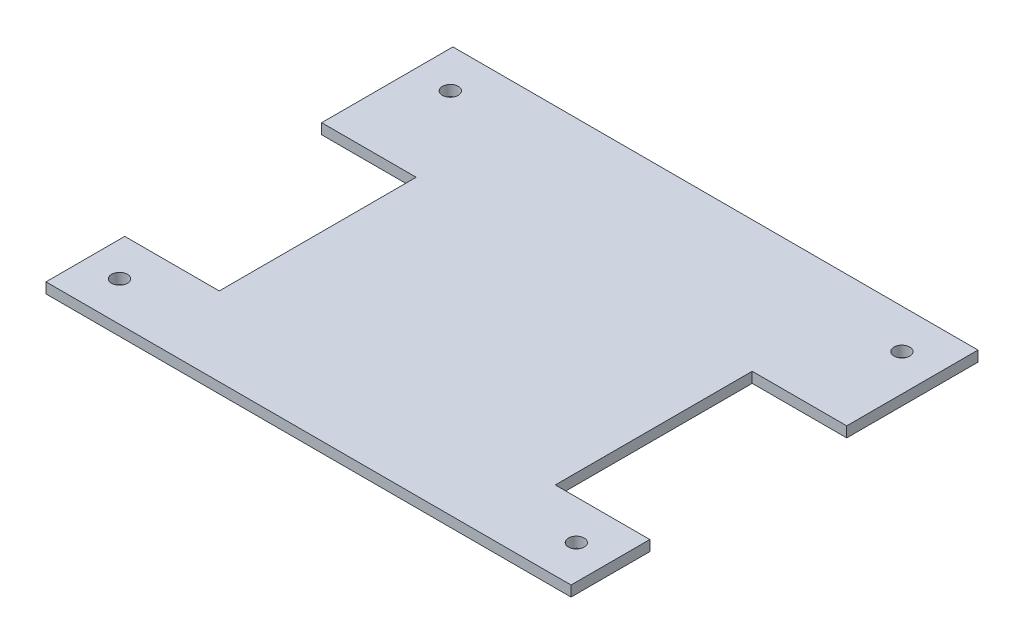
ISO-10303-21;
HEADER;
FILE_DESCRIPTION(('STEP AP214'),'2;1');
FILE_NAME('part.step','',(''),(''),'','','');
FILE_SCHEMA(('AUTOMOTIVE_DESIGN { 1 0 10303 214 1 1 1 1 }'));
ENDSEC;
DATA;
#1=APPLICATION_CONTEXT('core data for automotive mechanical design processes');
#2=APPLICATION_PROTOCOL_DEFINITION('international standard','automotive_design',2000,#1);
#3=PRODUCT_CONTEXT('',#1,'mechanical');
#4=PRODUCT('Part','Part','',(#3));
#5=PRODUCT_RELATED_PRODUCT_CATEGORY('part','',(#4));
#6=PRODUCT_DEFINITION_FORMATION('','',#4);
#7=PRODUCT_DEFINITION_CONTEXT('part definition',#1,'design');
#8=PRODUCT_DEFINITION('design','',#6,#7);
#9=PRODUCT_DEFINITION_SHAPE('','',#8);
#10=(LENGTH_UNIT() NAMED_UNIT(*) SI_UNIT(.MILLI.,.METRE.));
#11=(NAMED_UNIT(*) PLANE_ANGLE_UNIT() SI_UNIT($,.RADIAN.));
#12=(NAMED_UNIT(*) SI_UNIT($,.STERADIAN.) SOLID_ANGLE_UNIT());
#13=UNCERTAINTY_MEASURE_WITH_UNIT(LENGTH_MEASURE(1.E-05),#10,'distance_accuracy_value','');
#14=(GEOMETRIC_REPRESENTATION_CONTEXT(3) GLOBAL_UNCERTAINTY_ASSIGNED_CONTEXT((#13)) GLOBAL_UNIT_ASSIGNED_CONTEXT((#10,
#11,#12)) REPRESENTATION_CONTEXT('',''));
#15=CARTESIAN_POINT('',(0.,0.,0.));
#16=DIRECTION('',(0.,0.,1.));
#17=DIRECTION('',(1.,0.,0.));
#18=AXIS2_PLACEMENT_3D('',#15,#16,#17);
#19=CARTESIAN_POINT('',(0.,4.,0.));
#20=DIRECTION('',(0.,-1.,0.));
#21=DIRECTION('',(0.,0.,-1.));
#22=AXIS2_PLACEMENT_3D('',#19,#20,#21);
#23=PLANE('',#22);
#24=DIRECTION('',(0.,0.,1.));
#25=VECTOR('',#24,1.);
#26=CARTESIAN_POINT('',(-128.417283329708,4.,77.672449199559));
#27=LINE('',#26,#25);
#28=CARTESIAN_POINT('',(-128.417283329708,4.,77.672449199559));
#29=VERTEX_POINT('',#28);
#30=CARTESIAN_POINT('',(-128.417283329708,4.,107.672449199559));
#31=VERTEX_POINT('',#30);
#32=EDGE_CURVE('E204',#29,#31,#27,.T.);
#33=ORIENTED_EDGE('',*,*,#32,.T.);
#34=DIRECTION('',(1.,0.,0.));
#35=VECTOR('',#34,1.);
#36=CARTESIAN_POINT('',(71.5827166702925,4.,107.672449199559));
#37=LINE('',#36,#35);
#38=CARTESIAN_POINT('',(71.5827166702925,4.,107.672449199559));
#39=VERTEX_POINT('',#38);
#40=EDGE_CURVE('E116',#31,#39,#37,.T.);
#41=ORIENTED_EDGE('',*,*,#40,.T.);
#42=DIRECTION('',(0.,0.,-1.));
#43=VECTOR('',#42,1.);
#44=CARTESIAN_POINT('',(71.5827166702924,4.,77.672449199559));
#45=LINE('',#44,#43);
#46=CARTESIAN_POINT('',(71.5827166702924,4.,77.672449199559));
#47=VERTEX_POINT('',#46);
#48=EDGE_CURVE('E241',#39,#47,#45,.T.);
#49=ORIENTED_EDGE('',*,*,#48,.T.);
#50=DIRECTION('',(-1.,0.,0.));
#51=VECTOR('',#50,1.);
#52=CARTESIAN_POINT('',(35.5827166702924,4.,77.672449199559));
#53=LINE('',#52,#51);
#54=CARTESIAN_POINT('',(35.5827166702924,4.,77.672449199559));
#55=VERTEX_POINT('',#54);
#56=EDGE_CURVE('E261',#47,#55,#53,.T.);
#57=ORIENTED_EDGE('',*,*,#56,.T.);
#58=DIRECTION('',(0.,0.,-1.));
#59=VECTOR('',#58,1.);
#60=CARTESIAN_POINT('',(35.5827166702924,4.,2.67244919955896));
#61=LINE('',#60,#59);
#62=CARTESIAN_POINT('',(35.5827166702924,4.,2.67244919955896));
#63=VERTEX_POINT('',#62);
#64=EDGE_CURVE('E257',#55,#63,#61,.T.);
#65=ORIENTED_EDGE('',*,*,#64,.T.);
#66=DIRECTION('',(1.,0.,0.));
#67=VECTOR('',#66,1.);
#68=CARTESIAN_POINT('',(71.5827166702924,4.,2.67244919955896));
#69=LINE('',#68,#67);
#70=CARTESIAN_POINT('',(71.5827166702924,4.,2.67244919955896));
#71=VERTEX_POINT('',#70);
#72=EDGE_CURVE('E260',#63,#71,#69,.T.);
#73=ORIENTED_EDGE('',*,*,#72,.T.);
#74=DIRECTION('',(0.,0.,-1.));
#75=VECTOR('',#74,1.);
#76=CARTESIAN_POINT('',(71.5827166702924,4.,-47.3275508004411));
#77=LINE('',#76,#75);
#78=CARTESIAN_POINT('',(71.5827166702924,4.,-47.3275508004411));
#79=VERTEX_POINT('',#78);
#80=EDGE_CURVE('E265',#71,#79,#77,.T.);
#81=ORIENTED_EDGE('',*,*,#80,.T.);
#82=DIRECTION('',(-1.,0.,0.));
#83=VECTOR('',#82,1.);
#84=CARTESIAN_POINT('',(-128.417283329708,4.,-47.327550800441));
#85=LINE('',#84,#83);
#86=CARTESIAN_POINT('',(-128.417283329708,4.,-47.327550800441));
#87=VERTEX_POINT('',#86);
#88=EDGE_CURVE('E272',#79,#87,#85,.T.);
#89=ORIENTED_EDGE('',*,*,#88,.T.);
#90=DIRECTION('',(0.,0.,1.));
#91=VECTOR('',#90,1.);
#92=CARTESIAN_POINT('',(-128.417283329708,4.,-47.327550800441));
#93=LINE('',#92,#91);
#94=CARTESIAN_POINT('',(-128.417283329708,4.,2.67244919955896));
#95=VERTEX_POINT('',#94);
#96=EDGE_CURVE('E147',#87,#95,#93,.T.);
#97=ORIENTED_EDGE('',*,*,#96,.T.);
#98=DIRECTION('',(1.,0.,0.));
#99=VECTOR('',#98,1.);
#100=CARTESIAN_POINT('',(-128.417283329708,4.,2.67244919955896));
#101=LINE('',#100,#99);
#102=CARTESIAN_POINT('',(-92.4172833297076,4.,2.67244919955896));
#103=VERTEX_POINT('',#102);
#104=EDGE_CURVE('E141',#95,#103,#101,.T.);
#105=ORIENTED_EDGE('',*,*,#104,.T.);
#106=DIRECTION('',(0.,0.,1.));
#107=VECTOR('',#106,1.);
#108=CARTESIAN_POINT('',(-92.4172833297076,4.,2.67244919955896));
#109=LINE('',#108,#107);
#110=CARTESIAN_POINT('',(-92.4172833297076,4.,77.672449199559));
#111=VERTEX_POINT('',#110);
#112=EDGE_CURVE('E145',#103,#111,#109,.T.);
#113=ORIENTED_EDGE('',*,*,#112,.T.);
#114=DIRECTION('',(-1.,0.,0.));
#115=VECTOR('',#114,1.);
#116=CARTESIAN_POINT('',(-92.4172833297076,4.,77.672449199559));
#117=LINE('',#116,#115);
#118=EDGE_CURVE('E61',#111,#29,#117,.T.);
#119=ORIENTED_EDGE('',*,*,#118,.T.);
#120=EDGE_LOOP('',(#33,#41,#49,#57,#65,#73,#81,#89,#97,#105,#113,#119));
#121=FACE_BOUND('',#120,.T.);
#122=CARTESIAN_POINT('',(-115.417283329708,4.,92.672449199559));
#123=DIRECTION('',(0.,1.,0.));
#124=DIRECTION('',(0.,0.,1.));
#125=AXIS2_PLACEMENT_3D('',#122,#123,#124);
#126=CIRCLE('',#125,3.00000000000001);
#127=CARTESIAN_POINT('',(-115.417283329708,4.,95.672449199559));
#128=VERTEX_POINT('',#127);
#129=EDGE_CURVE('E174',#128,#128,#126,.T.);
#130=ORIENTED_EDGE('',*,*,#129,.F.);
#131=EDGE_LOOP('',(#130));
#132=FACE_BOUND('',#131,.T.);
#133=CARTESIAN_POINT('',(58.5827166702924,4.,92.6724491995589));
#134=DIRECTION('',(0.,1.,0.));
#135=DIRECTION('',(0.,0.,-1.));
#136=AXIS2_PLACEMENT_3D('',#133,#134,#135);
#137=CIRCLE('',#136,3.00000000000001);
#138=CARTESIAN_POINT('',(58.5827166702924,4.,89.6724491995589));
#139=VERTEX_POINT('',#138);
#140=EDGE_CURVE('E342',#139,#139,#137,.T.);
#141=ORIENTED_EDGE('',*,*,#140,.F.);
#142=EDGE_LOOP('',(#141));
#143=FACE_BOUND('',#142,.T.);
#144=CARTESIAN_POINT('',(-114.417283329708,4.,-32.327550800441));
#145=DIRECTION('',(0.,1.,0.));
#146=DIRECTION('',(0.,0.,1.));
#147=AXIS2_PLACEMENT_3D('',#144,#145,#146);
#148=CIRCLE('',#147,3.00000000000001);
#149=CARTESIAN_POINT('',(-114.417283329708,4.,-29.327550800441));
#150=VERTEX_POINT('',#149);
#151=EDGE_CURVE('E334',#150,#150,#148,.T.);
#152=ORIENTED_EDGE('',*,*,#151,.F.);
#153=EDGE_LOOP('',(#152));
#154=FACE_BOUND('',#153,.T.);
#155=CARTESIAN_POINT('',(57.5827166702924,4.,-32.3275508004411));
#156=DIRECTION('',(0.,1.,0.));
#157=DIRECTION('',(0.,0.,-1.));
#158=AXIS2_PLACEMENT_3D('',#155,#156,#157);
#159=CIRCLE('',#158,3.00000000000004);
#160=CARTESIAN_POINT('',(57.5827166702924,4.,-35.3275508004411));
#161=VERTEX_POINT('',#160);
#162=EDGE_CURVE('E323',#161,#161,#159,.T.);
#163=ORIENTED_EDGE('',*,*,#162,.F.);
#164=EDGE_LOOP('',(#163));
#165=FACE_BOUND('',#164,.T.);
#166=ADVANCED_FACE('F43',(#121,#132,#143,#154,#165),#23,.F.);
#167=CARTESIAN_POINT('',(0.,0.,0.));
#168=DIRECTION('',(0.,-1.,0.));
#169=DIRECTION('',(0.,0.,-1.));
#170=AXIS2_PLACEMENT_3D('',#167,#168,#169);
#171=PLANE('',#170);
#172=CARTESIAN_POINT('',(-114.417283329708,0.,-32.327550800441));
#173=DIRECTION('',(0.,1.,0.));
#174=DIRECTION('',(0.,0.,1.));
#175=AXIS2_PLACEMENT_3D('',#172,#173,#174);
#176=CIRCLE('',#175,3.00000000000001);
#177=CARTESIAN_POINT('',(-114.417283329708,0.,-29.327550800441));
#178=VERTEX_POINT('',#177);
#179=EDGE_CURVE('E331',#178,#178,#176,.T.);
#180=ORIENTED_EDGE('',*,*,#179,.T.);
#181=EDGE_LOOP('',(#180));
#182=FACE_BOUND('',#181,.T.);
#183=CARTESIAN_POINT('',(-115.417283329708,0.,92.672449199559));
#184=DIRECTION('',(0.,1.,0.));
#185=DIRECTION('',(0.,0.,1.));
#186=AXIS2_PLACEMENT_3D('',#183,#184,#185);
#187=CIRCLE('',#186,3.00000000000001);
#188=CARTESIAN_POINT('',(-115.417283329708,0.,95.672449199559));
#189=VERTEX_POINT('',#188);
#190=EDGE_CURVE('E346',#189,#189,#187,.T.);
#191=ORIENTED_EDGE('',*,*,#190,.T.);
#192=EDGE_LOOP('',(#191));
#193=FACE_BOUND('',#192,.T.);
#194=DIRECTION('',(0.,0.,1.));
#195=VECTOR('',#194,1.);
#196=CARTESIAN_POINT('',(-128.417283329708,0.,77.672449199559));
#197=LINE('',#196,#195);
#198=CARTESIAN_POINT('',(-128.417283329708,0.,77.672449199559));
#199=VERTEX_POINT('',#198);
#200=CARTESIAN_POINT('',(-128.417283329708,0.,107.672449199559));
#201=VERTEX_POINT('',#200);
#202=EDGE_CURVE('E169',#199,#201,#197,.T.);
#203=ORIENTED_EDGE('',*,*,#202,.F.);
#204=DIRECTION('',(-1.,0.,0.));
#205=VECTOR('',#204,1.);
#206=CARTESIAN_POINT('',(-92.4172833297076,0.,77.672449199559));
#207=LINE('',#206,#205);
#208=CARTESIAN_POINT('',(-92.4172833297076,0.,77.672449199559));
#209=VERTEX_POINT('',#208);
#210=EDGE_CURVE('E108',#209,#199,#207,.T.);
#211=ORIENTED_EDGE('',*,*,#210,.F.);
#212=DIRECTION('',(0.,0.,1.));
#213=VECTOR('',#212,1.);
#214=CARTESIAN_POINT('',(-92.4172833297076,0.,2.67244919955896));
#215=LINE('',#214,#213);
#216=CARTESIAN_POINT('',(-92.4172833297076,0.,2.67244919955896));
#217=VERTEX_POINT('',#216);
#218=EDGE_CURVE('E102',#217,#209,#215,.T.);
#219=ORIENTED_EDGE('',*,*,#218,.F.);
#220=DIRECTION('',(1.,0.,0.));
#221=VECTOR('',#220,1.);
#222=CARTESIAN_POINT('',(-128.417283329708,0.,2.67244919955896));
#223=LINE('',#222,#221);
#224=CARTESIAN_POINT('',(-128.417283329708,0.,2.67244919955896));
#225=VERTEX_POINT('',#224);
#226=EDGE_CURVE('E156',#225,#217,#223,.T.);
#227=ORIENTED_EDGE('',*,*,#226,.F.);
#228=DIRECTION('',(0.,0.,1.));
#229=VECTOR('',#228,1.);
#230=CARTESIAN_POINT('',(-128.417283329708,0.,-47.327550800441));
#231=LINE('',#230,#229);
#232=CARTESIAN_POINT('',(-128.417283329708,0.,-47.327550800441));
#233=VERTEX_POINT('',#232);
#234=EDGE_CURVE('E195',#233,#225,#231,.T.);
#235=ORIENTED_EDGE('',*,*,#234,.F.);
#236=DIRECTION('',(-1.,0.,0.));
#237=VECTOR('',#236,1.);
#238=CARTESIAN_POINT('',(-128.417283329708,0.,-47.327550800441));
#239=LINE('',#238,#237);
#240=CARTESIAN_POINT('',(71.5827166702924,0.,-47.3275508004411));
#241=VERTEX_POINT('',#240);
#242=EDGE_CURVE('E192',#241,#233,#239,.T.);
#243=ORIENTED_EDGE('',*,*,#242,.F.);
#244=DIRECTION('',(0.,0.,-1.));
#245=VECTOR('',#244,1.);
#246=CARTESIAN_POINT('',(71.5827166702924,0.,-47.3275508004411));
#247=LINE('',#246,#245);
#248=CARTESIAN_POINT('',(71.5827166702924,0.,2.67244919955896));
#249=VERTEX_POINT('',#248);
#250=EDGE_CURVE('E189',#249,#241,#247,.T.);
#251=ORIENTED_EDGE('',*,*,#250,.F.);
#252=DIRECTION('',(1.,0.,0.));
#253=VECTOR('',#252,1.);
#254=CARTESIAN_POINT('',(71.5827166702924,0.,2.67244919955896));
#255=LINE('',#254,#253);
#256=CARTESIAN_POINT('',(35.5827166702924,0.,2.67244919955896));
#257=VERTEX_POINT('',#256);
#258=EDGE_CURVE('E186',#257,#249,#255,.T.);
#259=ORIENTED_EDGE('',*,*,#258,.F.);
#260=DIRECTION('',(0.,0.,-1.));
#261=VECTOR('',#260,1.);
#262=CARTESIAN_POINT('',(35.5827166702924,0.,2.67244919955896));
#263=LINE('',#262,#261);
#264=CARTESIAN_POINT('',(35.5827166702924,0.,77.672449199559));
#265=VERTEX_POINT('',#264);
#266=EDGE_CURVE('E183',#265,#257,#263,.T.);
#267=ORIENTED_EDGE('',*,*,#266,.F.);
#268=DIRECTION('',(-1.,0.,0.));
#269=VECTOR('',#268,1.);
#270=CARTESIAN_POINT('',(35.5827166702924,0.,77.672449199559));
#271=LINE('',#270,#269);
#272=CARTESIAN_POINT('',(71.5827166702924,0.,77.672449199559));
#273=VERTEX_POINT('',#272);
#274=EDGE_CURVE('E180',#273,#265,#271,.T.);
#275=ORIENTED_EDGE('',*,*,#274,.F.);
#276=DIRECTION('',(0.,0.,-1.));
#277=VECTOR('',#276,1.);
#278=CARTESIAN_POINT('',(71.5827166702924,0.,77.672449199559));
#279=LINE('',#278,#277);
#280=CARTESIAN_POINT('',(71.5827166702925,0.,107.672449199559));
#281=VERTEX_POINT('',#280);
#282=EDGE_CURVE('E177',#281,#273,#279,.T.);
#283=ORIENTED_EDGE('',*,*,#282,.F.);
#284=DIRECTION('',(1.,0.,0.));
#285=VECTOR('',#284,1.);
#286=CARTESIAN_POINT('',(71.5827166702925,0.,107.672449199559));
#287=LINE('',#286,#285);
#288=EDGE_CURVE('E173',#201,#281,#287,.T.);
#289=ORIENTED_EDGE('',*,*,#288,.F.);
#290=EDGE_LOOP('',(#203,#211,#219,#227,#235,#243,#251,#259,#267,#275,#283,#289));
#291=FACE_BOUND('',#290,.T.);
#292=CARTESIAN_POINT('',(58.5827166702924,0.,92.6724491995589));
#293=DIRECTION('',(0.,1.,0.));
#294=DIRECTION('',(0.,0.,-1.));
#295=AXIS2_PLACEMENT_3D('',#292,#293,#294);
#296=CIRCLE('',#295,3.00000000000001);
#297=CARTESIAN_POINT('',(58.5827166702924,0.,89.6724491995589));
#298=VERTEX_POINT('',#297);
#299=EDGE_CURVE('E338',#298,#298,#296,.T.);
#300=ORIENTED_EDGE('',*,*,#299,.T.);
#301=EDGE_LOOP('',(#300));
#302=FACE_BOUND('',#301,.T.);
#303=CARTESIAN_POINT('',(57.5827166702924,0.,-32.3275508004411));
#304=DIRECTION('',(0.,1.,0.));
#305=DIRECTION('',(0.,0.,-1.));
#306=AXIS2_PLACEMENT_3D('',#303,#304,#305);
#307=CIRCLE('',#306,3.00000000000004);
#308=CARTESIAN_POINT('',(57.5827166702924,0.,-35.3275508004411));
#309=VERTEX_POINT('',#308);
#310=EDGE_CURVE('E326',#309,#309,#307,.T.);
#311=ORIENTED_EDGE('',*,*,#310,.T.);
#312=EDGE_LOOP('',(#311));
#313=FACE_BOUND('',#312,.T.);
#314=ADVANCED_FACE('F245',(#182,#193,#291,#302,#313),#171,.T.);
#315=CARTESIAN_POINT('',(-128.417283329708,4.,77.672449199559));
#316=DIRECTION('',(1.,0.,0.));
#317=DIRECTION('',(0.,0.,-1.));
#318=AXIS2_PLACEMENT_3D('',#315,#316,#317);
#319=PLANE('',#318);
#320=ORIENTED_EDGE('',*,*,#202,.T.);
#321=DIRECTION('',(0.,-1.,0.));
#322=VECTOR('',#321,1.);
#323=CARTESIAN_POINT('',(-128.417283329708,4.,107.672449199559));
#324=LINE('',#323,#322);
#325=EDGE_CURVE('E11',#31,#201,#324,.T.);
#326=ORIENTED_EDGE('',*,*,#325,.F.);
#327=ORIENTED_EDGE('',*,*,#32,.F.);
#328=DIRECTION('',(0.,-1.,0.));
#329=VECTOR('',#328,1.);
#330=CARTESIAN_POINT('',(-128.417283329708,4.,77.672449199559));
#331=LINE('',#330,#329);
#332=EDGE_CURVE('E165',#29,#199,#331,.T.);
#333=ORIENTED_EDGE('',*,*,#332,.T.);
#334=EDGE_LOOP('',(#320,#326,#327,#333));
#335=FACE_BOUND('',#334,.T.);
#336=ADVANCED_FACE('F45',(#335),#319,.F.);
#337=CARTESIAN_POINT('',(71.5827166702925,4.,107.672449199559));
#338=DIRECTION('',(0.,0.,-1.));
#339=DIRECTION('',(-1.,0.,0.));
#340=AXIS2_PLACEMENT_3D('',#337,#338,#339);
#341=PLANE('',#340);
#342=ORIENTED_EDGE('',*,*,#288,.T.);
#343=DIRECTION('',(0.,-1.,0.));
#344=VECTOR('',#343,1.);
#345=CARTESIAN_POINT('',(71.5827166702925,4.,107.672449199559));
#346=LINE('',#345,#344);
#347=EDGE_CURVE('E53',#39,#281,#346,.T.);
#348=ORIENTED_EDGE('',*,*,#347,.F.);
#349=ORIENTED_EDGE('',*,*,#40,.F.);
#350=ORIENTED_EDGE('',*,*,#325,.T.);
#351=EDGE_LOOP('',(#342,#348,#349,#350));
#352=FACE_BOUND('',#351,.T.);
#353=ADVANCED_FACE('F474',(#352),#341,.F.);
#354=CARTESIAN_POINT('',(71.5827166702924,4.,77.672449199559));
#355=DIRECTION('',(-1.,0.,0.));
#356=DIRECTION('',(0.,0.,1.));
#357=AXIS2_PLACEMENT_3D('',#354,#355,#356);
#358=PLANE('',#357);
#359=ORIENTED_EDGE('',*,*,#282,.T.);
#360=DIRECTION('',(0.,-1.,0.));
#361=VECTOR('',#360,1.);
#362=CARTESIAN_POINT('',(71.5827166702924,4.,77.672449199559));
#363=LINE('',#362,#361);
#364=EDGE_CURVE('E231',#47,#273,#363,.T.);
#365=ORIENTED_EDGE('',*,*,#364,.F.);
#366=ORIENTED_EDGE('',*,*,#48,.F.);
#367=ORIENTED_EDGE('',*,*,#347,.T.);
#368=EDGE_LOOP('',(#359,#365,#366,#367));
#369=FACE_BOUND('',#368,.T.);
#370=ADVANCED_FACE('F239',(#369),#358,.F.);
#371=CARTESIAN_POINT('',(35.5827166702924,4.,77.672449199559));
#372=DIRECTION('',(0.,0.,1.));
#373=DIRECTION('',(1.,0.,0.));
#374=AXIS2_PLACEMENT_3D('',#371,#372,#373);
#375=PLANE('',#374);
#376=ORIENTED_EDGE('',*,*,#274,.T.);
#377=DIRECTION('',(0.,-1.,0.));
#378=VECTOR('',#377,1.);
#379=CARTESIAN_POINT('',(35.5827166702924,4.,77.672449199559));
#380=LINE('',#379,#378);
#381=EDGE_CURVE('E227',#55,#265,#380,.T.);
#382=ORIENTED_EDGE('',*,*,#381,.F.);
#383=ORIENTED_EDGE('',*,*,#56,.F.);
#384=ORIENTED_EDGE('',*,*,#364,.T.);
#385=EDGE_LOOP('',(#376,#382,#383,#384));
#386=FACE_BOUND('',#385,.T.);
#387=ADVANCED_FACE('F251',(#386),#375,.F.);
#388=CARTESIAN_POINT('',(35.5827166702924,4.,2.67244919955896));
#389=DIRECTION('',(-1.,0.,0.));
#390=DIRECTION('',(0.,0.,1.));
#391=AXIS2_PLACEMENT_3D('',#388,#389,#390);
#392=PLANE('',#391);
#393=ORIENTED_EDGE('',*,*,#266,.T.);
#394=DIRECTION('',(0.,-1.,0.));
#395=VECTOR('',#394,1.);
#396=CARTESIAN_POINT('',(35.5827166702924,4.,2.67244919955896));
#397=LINE('',#396,#395);
#398=EDGE_CURVE('E223',#63,#257,#397,.T.);
#399=ORIENTED_EDGE('',*,*,#398,.F.);
#400=ORIENTED_EDGE('',*,*,#64,.F.);
#401=ORIENTED_EDGE('',*,*,#381,.T.);
#402=EDGE_LOOP('',(#393,#399,#400,#401));
#403=FACE_BOUND('',#402,.T.);
#404=ADVANCED_FACE('F255',(#403),#392,.F.);
#405=CARTESIAN_POINT('',(71.5827166702924,4.,2.67244919955896));
#406=DIRECTION('',(0.,0.,-1.));
#407=DIRECTION('',(-1.,0.,0.));
#408=AXIS2_PLACEMENT_3D('',#405,#406,#407);
#409=PLANE('',#408);
#410=ORIENTED_EDGE('',*,*,#258,.T.);
#411=DIRECTION('',(0.,-1.,0.));
#412=VECTOR('',#411,1.);
#413=CARTESIAN_POINT('',(71.5827166702924,4.,2.67244919955896));
#414=LINE('',#413,#412);
#415=EDGE_CURVE('E219',#71,#249,#414,.T.);
#416=ORIENTED_EDGE('',*,*,#415,.F.);
#417=ORIENTED_EDGE('',*,*,#72,.F.);
#418=ORIENTED_EDGE('',*,*,#398,.T.);
#419=EDGE_LOOP('',(#410,#416,#417,#418));
#420=FACE_BOUND('',#419,.T.);
#421=ADVANCED_FACE('F435',(#420),#409,.F.);
#422=CARTESIAN_POINT('',(71.5827166702924,4.,-47.3275508004411));
#423=DIRECTION('',(-1.,0.,0.));
#424=DIRECTION('',(0.,0.,1.));
#425=AXIS2_PLACEMENT_3D('',#422,#423,#424);
#426=PLANE('',#425);
#427=ORIENTED_EDGE('',*,*,#250,.T.);
#428=DIRECTION('',(0.,-1.,0.));
#429=VECTOR('',#428,1.);
#430=CARTESIAN_POINT('',(71.5827166702924,4.,-47.3275508004411));
#431=LINE('',#430,#429);
#432=EDGE_CURVE('E215',#79,#241,#431,.T.);
#433=ORIENTED_EDGE('',*,*,#432,.F.);
#434=ORIENTED_EDGE('',*,*,#80,.F.);
#435=ORIENTED_EDGE('',*,*,#415,.T.);
#436=EDGE_LOOP('',(#427,#433,#434,#435));
#437=FACE_BOUND('',#436,.T.);
#438=ADVANCED_FACE('F425',(#437),#426,.F.);
#439=CARTESIAN_POINT('',(-128.417283329708,4.,-47.327550800441));
#440=DIRECTION('',(0.,0.,1.));
#441=DIRECTION('',(1.,0.,0.));
#442=AXIS2_PLACEMENT_3D('',#439,#440,#441);
#443=PLANE('',#442);
#444=ORIENTED_EDGE('',*,*,#242,.T.);
#445=DIRECTION('',(0.,-1.,0.));
#446=VECTOR('',#445,1.);
#447=CARTESIAN_POINT('',(-128.417283329708,4.,-47.327550800441));
#448=LINE('',#447,#446);
#449=EDGE_CURVE('E211',#87,#233,#448,.T.);
#450=ORIENTED_EDGE('',*,*,#449,.F.);
#451=ORIENTED_EDGE('',*,*,#88,.F.);
#452=ORIENTED_EDGE('',*,*,#432,.T.);
#453=EDGE_LOOP('',(#444,#450,#451,#452));
#454=FACE_BOUND('',#453,.T.);
#455=ADVANCED_FACE('F280',(#454),#443,.F.);
#456=CARTESIAN_POINT('',(-128.417283329708,4.,-47.327550800441));
#457=DIRECTION('',(1.,0.,0.));
#458=DIRECTION('',(0.,0.,-1.));
#459=AXIS2_PLACEMENT_3D('',#456,#457,#458);
#460=PLANE('',#459);
#461=ORIENTED_EDGE('',*,*,#234,.T.);
#462=DIRECTION('',(0.,-1.,0.));
#463=VECTOR('',#462,1.);
#464=CARTESIAN_POINT('',(-128.417283329708,4.,2.67244919955896));
#465=LINE('',#464,#463);
#466=EDGE_CURVE('E158',#95,#225,#465,.T.);
#467=ORIENTED_EDGE('',*,*,#466,.F.);
#468=ORIENTED_EDGE('',*,*,#96,.F.);
#469=ORIENTED_EDGE('',*,*,#449,.T.);
#470=EDGE_LOOP('',(#461,#467,#468,#469));
#471=FACE_BOUND('',#470,.T.);
#472=ADVANCED_FACE('F284',(#471),#460,.F.);
#473=CARTESIAN_POINT('',(-128.417283329708,4.,2.67244919955896));
#474=DIRECTION('',(0.,0.,-1.));
#475=DIRECTION('',(-1.,0.,0.));
#476=AXIS2_PLACEMENT_3D('',#473,#474,#475);
#477=PLANE('',#476);
#478=ORIENTED_EDGE('',*,*,#226,.T.);
#479=DIRECTION('',(0.,-1.,0.));
#480=VECTOR('',#479,1.);
#481=CARTESIAN_POINT('',(-92.4172833297076,4.,2.67244919955896));
#482=LINE('',#481,#480);
#483=EDGE_CURVE('E153',#103,#217,#482,.T.);
#484=ORIENTED_EDGE('',*,*,#483,.F.);
#485=ORIENTED_EDGE('',*,*,#104,.F.);
#486=ORIENTED_EDGE('',*,*,#466,.T.);
#487=EDGE_LOOP('',(#478,#484,#485,#486));
#488=FACE_BOUND('',#487,.T.);
#489=ADVANCED_FACE('F154',(#488),#477,.F.);
#490=CARTESIAN_POINT('',(-92.4172833297076,4.,2.67244919955896));
#491=DIRECTION('',(1.,0.,0.));
#492=DIRECTION('',(0.,0.,-1.));
#493=AXIS2_PLACEMENT_3D('',#490,#491,#492);
#494=PLANE('',#493);
#495=ORIENTED_EDGE('',*,*,#218,.T.);
#496=DIRECTION('',(0.,-1.,0.));
#497=VECTOR('',#496,1.);
#498=CARTESIAN_POINT('',(-92.4172833297076,4.,77.672449199559));
#499=LINE('',#498,#497);
#500=EDGE_CURVE('E159',#111,#209,#499,.T.);
#501=ORIENTED_EDGE('',*,*,#500,.F.);
#502=ORIENTED_EDGE('',*,*,#112,.F.);
#503=ORIENTED_EDGE('',*,*,#483,.T.);
#504=EDGE_LOOP('',(#495,#501,#502,#503));
#505=FACE_BOUND('',#504,.T.);
#506=ADVANCED_FACE('F161',(#505),#494,.F.);
#507=CARTESIAN_POINT('',(-92.4172833297076,4.,77.672449199559));
#508=DIRECTION('',(0.,0.,1.));
#509=DIRECTION('',(1.,0.,0.));
#510=AXIS2_PLACEMENT_3D('',#507,#508,#509);
#511=PLANE('',#510);
#512=ORIENTED_EDGE('',*,*,#210,.T.);
#513=ORIENTED_EDGE('',*,*,#332,.F.);
#514=ORIENTED_EDGE('',*,*,#118,.F.);
#515=ORIENTED_EDGE('',*,*,#500,.T.);
#516=EDGE_LOOP('',(#512,#513,#514,#515));
#517=FACE_BOUND('',#516,.T.);
#518=ADVANCED_FACE('F288',(#517),#511,.F.);
#519=CARTESIAN_POINT('',(-115.417283329708,4.,92.672449199559));
#520=DIRECTION('',(0.,-1.,0.));
#521=DIRECTION('',(0.,0.,-1.));
#522=AXIS2_PLACEMENT_3D('',#519,#520,#521);
#523=CYLINDRICAL_SURFACE('',#522,3.00000000000001);
#524=ORIENTED_EDGE('',*,*,#129,.T.);
#525=EDGE_LOOP('',(#524));
#526=FACE_BOUND('',#525,.T.);
#527=ORIENTED_EDGE('',*,*,#190,.F.);
#528=EDGE_LOOP('',(#527));
#529=FACE_BOUND('',#528,.T.);
#530=ADVANCED_FACE('F290',(#526,#529),#523,.F.);
#531=CARTESIAN_POINT('',(58.5827166702924,4.,92.6724491995589));
#532=DIRECTION('',(0.,-1.,0.));
#533=DIRECTION('',(0.,0.,-1.));
#534=AXIS2_PLACEMENT_3D('',#531,#532,#533);
#535=CYLINDRICAL_SURFACE('',#534,3.00000000000001);
#536=ORIENTED_EDGE('',*,*,#140,.T.);
#537=EDGE_LOOP('',(#536));
#538=FACE_BOUND('',#537,.T.);
#539=ORIENTED_EDGE('',*,*,#299,.F.);
#540=EDGE_LOOP('',(#539));
#541=FACE_BOUND('',#540,.T.);
#542=ADVANCED_FACE('F296',(#538,#541),#535,.F.);
#543=CARTESIAN_POINT('',(-114.417283329708,4.,-32.327550800441));
#544=DIRECTION('',(0.,-1.,0.));
#545=DIRECTION('',(0.,0.,-1.));
#546=AXIS2_PLACEMENT_3D('',#543,#544,#545);
#547=CYLINDRICAL_SURFACE('',#546,3.00000000000001);
#548=ORIENTED_EDGE('',*,*,#151,.T.);
#549=EDGE_LOOP('',(#548));
#550=FACE_BOUND('',#549,.T.);
#551=ORIENTED_EDGE('',*,*,#179,.F.);
#552=EDGE_LOOP('',(#551));
#553=FACE_BOUND('',#552,.T.);
#554=ADVANCED_FACE('F310',(#550,#553),#547,.F.);
#555=CARTESIAN_POINT('',(57.5827166702924,4.,-32.3275508004411));
#556=DIRECTION('',(0.,-1.,0.));
#557=DIRECTION('',(0.,0.,-1.));
#558=AXIS2_PLACEMENT_3D('',#555,#556,#557);
#559=CYLINDRICAL_SURFACE('',#558,3.00000000000004);
#560=ORIENTED_EDGE('',*,*,#162,.T.);
#561=EDGE_LOOP('',(#560));
#562=FACE_BOUND('',#561,.T.);
#563=ORIENTED_EDGE('',*,*,#310,.F.);
#564=EDGE_LOOP('',(#563));
#565=FACE_BOUND('',#564,.T.);
#566=ADVANCED_FACE('F314',(#562,#565),#559,.F.);
#567=CLOSED_SHELL('',(#166,#314,#336,#353,#370,#387,#404,#421,#438,#455,#472,#489,#506,#518,
#530,#542,#554,#566));
#568=MANIFOLD_SOLID_BREP('B2',#567);
#569=ADVANCED_BREP_SHAPE_REPRESENTATION('',(#18,#568),#14);
#570=SHAPE_DEFINITION_REPRESENTATION(#9,#569);
ENDSEC;
END-ISO-10303-21;
